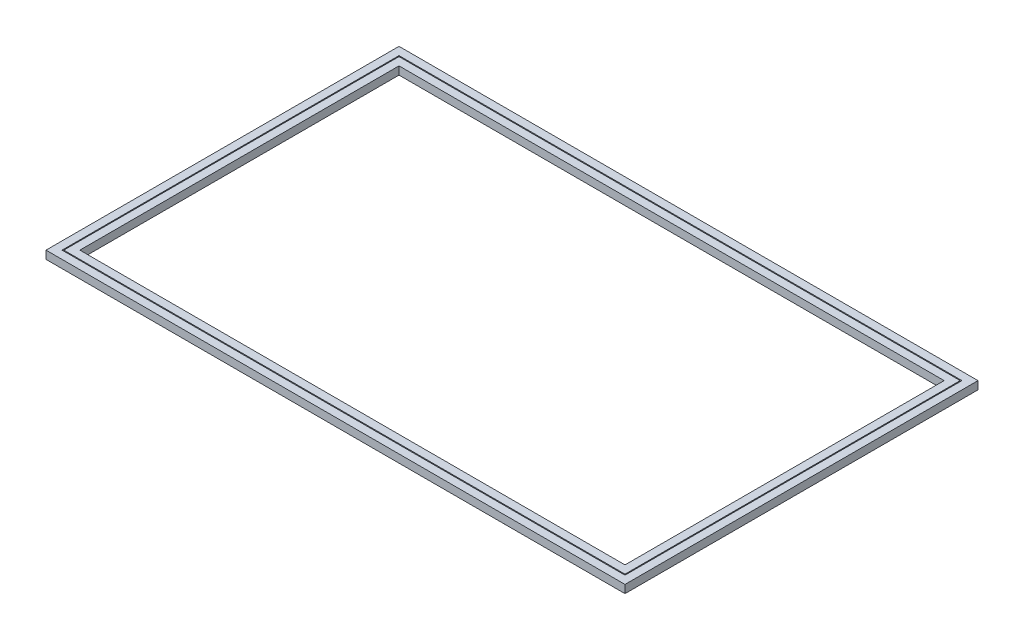
ISO-10303-21;
HEADER;
FILE_DESCRIPTION(('STEP AP214'),'2;1');
FILE_NAME('part.step','',(''),(''),'','','');
FILE_SCHEMA(('AUTOMOTIVE_DESIGN { 1 0 10303 214 1 1 1 1 }'));
ENDSEC;
DATA;
#1=APPLICATION_CONTEXT('core data for automotive mechanical design processes');
#2=APPLICATION_PROTOCOL_DEFINITION('international standard','automotive_design',2000,#1);
#3=PRODUCT_CONTEXT('',#1,'mechanical');
#4=PRODUCT('Part','Part','',(#3));
#5=PRODUCT_RELATED_PRODUCT_CATEGORY('part','',(#4));
#6=PRODUCT_DEFINITION_FORMATION('','',#4);
#7=PRODUCT_DEFINITION_CONTEXT('part definition',#1,'design');
#8=PRODUCT_DEFINITION('design','',#6,#7);
#9=PRODUCT_DEFINITION_SHAPE('','',#8);
#10=(LENGTH_UNIT() NAMED_UNIT(*) SI_UNIT(.MILLI.,.METRE.));
#11=(NAMED_UNIT(*) PLANE_ANGLE_UNIT() SI_UNIT($,.RADIAN.));
#12=(NAMED_UNIT(*) SI_UNIT($,.STERADIAN.) SOLID_ANGLE_UNIT());
#13=UNCERTAINTY_MEASURE_WITH_UNIT(LENGTH_MEASURE(1.E-05),#10,'distance_accuracy_value','');
#14=(GEOMETRIC_REPRESENTATION_CONTEXT(3) GLOBAL_UNCERTAINTY_ASSIGNED_CONTEXT((#13)) GLOBAL_UNIT_ASSIGNED_CONTEXT((#10,
#11,#12)) REPRESENTATION_CONTEXT('',''));
#15=CARTESIAN_POINT('',(0.,0.,0.));
#16=DIRECTION('',(0.,0.,1.));
#17=DIRECTION('',(1.,0.,0.));
#18=AXIS2_PLACEMENT_3D('',#15,#16,#17);
#19=CARTESIAN_POINT('',(0.,9.,189.11033394935));
#20=DIRECTION('',(0.,0.,1.));
#21=DIRECTION('',(1.,0.,0.));
#22=AXIS2_PLACEMENT_3D('',#19,#20,#21);
#23=PLANE('',#22);
#24=DIRECTION('',(-1.,0.,0.));
#25=VECTOR('',#24,1.);
#26=CARTESIAN_POINT('',(0.,0.,189.11033394935));
#27=LINE('',#26,#25);
#28=CARTESIAN_POINT('',(315.94131040575,0.,189.11033394935));
#29=VERTEX_POINT('',#28);
#30=CARTESIAN_POINT('',(-315.94131040575,0.,189.11033394935));
#31=VERTEX_POINT('',#30);
#32=EDGE_CURVE('E174',#29,#31,#27,.T.);
#33=ORIENTED_EDGE('',*,*,#32,.T.);
#34=DIRECTION('',(0.,-1.,0.));
#35=VECTOR('',#34,1.);
#36=CARTESIAN_POINT('',(-315.94131040575,9.,189.11033394935));
#37=LINE('',#36,#35);
#38=CARTESIAN_POINT('',(-315.94131040575,9.,189.11033394935));
#39=VERTEX_POINT('',#38);
#40=EDGE_CURVE('E13',#39,#31,#37,.T.);
#41=ORIENTED_EDGE('',*,*,#40,.F.);
#42=DIRECTION('',(-1.,0.,0.));
#43=VECTOR('',#42,1.);
#44=CARTESIAN_POINT('',(0.,9.,189.11033394935));
#45=LINE('',#44,#43);
#46=CARTESIAN_POINT('',(315.94131040575,9.,189.11033394935));
#47=VERTEX_POINT('',#46);
#48=EDGE_CURVE('E146',#47,#39,#45,.T.);
#49=ORIENTED_EDGE('',*,*,#48,.F.);
#50=DIRECTION('',(0.,-1.,0.));
#51=VECTOR('',#50,1.);
#52=CARTESIAN_POINT('',(315.94131040575,9.,189.11033394935));
#53=LINE('',#52,#51);
#54=EDGE_CURVE('E86',#47,#29,#53,.T.);
#55=ORIENTED_EDGE('',*,*,#54,.T.);
#56=EDGE_LOOP('',(#33,#41,#49,#55));
#57=FACE_BOUND('',#56,.T.);
#58=ADVANCED_FACE('F67',(#57),#23,.F.);
#59=CARTESIAN_POINT('',(-315.94131040575,9.,0.));
#60=DIRECTION('',(-1.,0.,0.));
#61=DIRECTION('',(0.,0.,1.));
#62=AXIS2_PLACEMENT_3D('',#59,#60,#61);
#63=PLANE('',#62);
#64=DIRECTION('',(0.,0.,-1.));
#65=VECTOR('',#64,1.);
#66=CARTESIAN_POINT('',(-315.94131040575,0.,0.));
#67=LINE('',#66,#65);
#68=CARTESIAN_POINT('',(-315.94131040575,0.,-189.11033394935));
#69=VERTEX_POINT('',#68);
#70=EDGE_CURVE('E152',#31,#69,#67,.T.);
#71=ORIENTED_EDGE('',*,*,#70,.T.);
#72=DIRECTION('',(0.,-1.,0.));
#73=VECTOR('',#72,1.);
#74=CARTESIAN_POINT('',(-315.94131040575,9.,-189.11033394935));
#75=LINE('',#74,#73);
#76=CARTESIAN_POINT('',(-315.94131040575,9.,-189.11033394935));
#77=VERTEX_POINT('',#76);
#78=EDGE_CURVE('E77',#77,#69,#75,.T.);
#79=ORIENTED_EDGE('',*,*,#78,.F.);
#80=DIRECTION('',(0.,0.,-1.));
#81=VECTOR('',#80,1.);
#82=CARTESIAN_POINT('',(-315.94131040575,9.,0.));
#83=LINE('',#82,#81);
#84=EDGE_CURVE('E140',#39,#77,#83,.T.);
#85=ORIENTED_EDGE('',*,*,#84,.F.);
#86=ORIENTED_EDGE('',*,*,#40,.T.);
#87=EDGE_LOOP('',(#71,#79,#85,#86));
#88=FACE_BOUND('',#87,.T.);
#89=ADVANCED_FACE('F151',(#88),#63,.F.);
#90=CARTESIAN_POINT('',(0.,9.,-189.11033394935));
#91=DIRECTION('',(0.,0.,1.));
#92=DIRECTION('',(1.,0.,0.));
#93=AXIS2_PLACEMENT_3D('',#90,#91,#92);
#94=PLANE('',#93);
#95=DIRECTION('',(-1.,0.,0.));
#96=VECTOR('',#95,1.);
#97=CARTESIAN_POINT('',(0.,0.,-189.11033394935));
#98=LINE('',#97,#96);
#99=CARTESIAN_POINT('',(315.94131040575,0.,-189.11033394935));
#100=VERTEX_POINT('',#99);
#101=EDGE_CURVE('E177',#100,#69,#98,.T.);
#102=ORIENTED_EDGE('',*,*,#101,.F.);
#103=DIRECTION('',(0.,-1.,0.));
#104=VECTOR('',#103,1.);
#105=CARTESIAN_POINT('',(315.94131040575,9.,-189.11033394935));
#106=LINE('',#105,#104);
#107=CARTESIAN_POINT('',(315.94131040575,9.,-189.11033394935));
#108=VERTEX_POINT('',#107);
#109=EDGE_CURVE('E112',#108,#100,#106,.T.);
#110=ORIENTED_EDGE('',*,*,#109,.F.);
#111=DIRECTION('',(-1.,0.,0.));
#112=VECTOR('',#111,1.);
#113=CARTESIAN_POINT('',(0.,9.,-189.11033394935));
#114=LINE('',#113,#112);
#115=EDGE_CURVE('E145',#108,#77,#114,.T.);
#116=ORIENTED_EDGE('',*,*,#115,.T.);
#117=ORIENTED_EDGE('',*,*,#78,.T.);
#118=EDGE_LOOP('',(#102,#110,#116,#117));
#119=FACE_BOUND('',#118,.T.);
#120=ADVANCED_FACE('F156',(#119),#94,.T.);
#121=CARTESIAN_POINT('',(-324.94131040575,9.,0.));
#122=DIRECTION('',(-1.,0.,0.));
#123=DIRECTION('',(0.,0.,1.));
#124=AXIS2_PLACEMENT_3D('',#121,#122,#123);
#125=PLANE('',#124);
#126=DIRECTION('',(0.,0.,-1.));
#127=VECTOR('',#126,1.);
#128=CARTESIAN_POINT('',(-324.94131040575,0.,0.));
#129=LINE('',#128,#127);
#130=CARTESIAN_POINT('',(-324.94131040575,0.,198.11033394935));
#131=VERTEX_POINT('',#130);
#132=CARTESIAN_POINT('',(-324.94131040575,0.,-198.11033394935));
#133=VERTEX_POINT('',#132);
#134=EDGE_CURVE('E163',#131,#133,#129,.T.);
#135=ORIENTED_EDGE('',*,*,#134,.F.);
#136=DIRECTION('',(0.,-1.,0.));
#137=VECTOR('',#136,1.);
#138=CARTESIAN_POINT('',(-324.94131040575,9.,198.11033394935));
#139=LINE('',#138,#137);
#140=CARTESIAN_POINT('',(-324.94131040575,9.,198.11033394935));
#141=VERTEX_POINT('',#140);
#142=EDGE_CURVE('E71',#141,#131,#139,.T.);
#143=ORIENTED_EDGE('',*,*,#142,.F.);
#144=DIRECTION('',(0.,0.,-1.));
#145=VECTOR('',#144,1.);
#146=CARTESIAN_POINT('',(-324.94131040575,9.,0.));
#147=LINE('',#146,#145);
#148=CARTESIAN_POINT('',(-324.94131040575,9.,-198.11033394935));
#149=VERTEX_POINT('',#148);
#150=EDGE_CURVE('E182',#141,#149,#147,.T.);
#151=ORIENTED_EDGE('',*,*,#150,.T.);
#152=DIRECTION('',(0.,-1.,0.));
#153=VECTOR('',#152,1.);
#154=CARTESIAN_POINT('',(-324.94131040575,9.,-198.11033394935));
#155=LINE('',#154,#153);
#156=EDGE_CURVE('E159',#149,#133,#155,.T.);
#157=ORIENTED_EDGE('',*,*,#156,.T.);
#158=EDGE_LOOP('',(#135,#143,#151,#157));
#159=FACE_BOUND('',#158,.T.);
#160=ADVANCED_FACE('F69',(#159),#125,.T.);
#161=CARTESIAN_POINT('',(0.,9.,198.11033394935));
#162=DIRECTION('',(0.,0.,1.));
#163=DIRECTION('',(1.,0.,0.));
#164=AXIS2_PLACEMENT_3D('',#161,#162,#163);
#165=PLANE('',#164);
#166=DIRECTION('',(-1.,0.,0.));
#167=VECTOR('',#166,1.);
#168=CARTESIAN_POINT('',(0.,0.,198.11033394935));
#169=LINE('',#168,#167);
#170=CARTESIAN_POINT('',(324.94131040575,0.,198.11033394935));
#171=VERTEX_POINT('',#170);
#172=EDGE_CURVE('E166',#171,#131,#169,.T.);
#173=ORIENTED_EDGE('',*,*,#172,.F.);
#174=DIRECTION('',(0.,-1.,0.));
#175=VECTOR('',#174,1.);
#176=CARTESIAN_POINT('',(324.94131040575,9.,198.11033394935));
#177=LINE('',#176,#175);
#178=CARTESIAN_POINT('',(324.94131040575,9.,198.11033394935));
#179=VERTEX_POINT('',#178);
#180=EDGE_CURVE('E188',#179,#171,#177,.T.);
#181=ORIENTED_EDGE('',*,*,#180,.F.);
#182=DIRECTION('',(-1.,0.,0.));
#183=VECTOR('',#182,1.);
#184=CARTESIAN_POINT('',(0.,9.,198.11033394935));
#185=LINE('',#184,#183);
#186=EDGE_CURVE('E197',#179,#141,#185,.T.);
#187=ORIENTED_EDGE('',*,*,#186,.T.);
#188=ORIENTED_EDGE('',*,*,#142,.T.);
#189=EDGE_LOOP('',(#173,#181,#187,#188));
#190=FACE_BOUND('',#189,.T.);
#191=ADVANCED_FACE('F195',(#190),#165,.T.);
#192=CARTESIAN_POINT('',(324.94131040575,9.,0.));
#193=DIRECTION('',(-1.,0.,0.));
#194=DIRECTION('',(0.,0.,1.));
#195=AXIS2_PLACEMENT_3D('',#192,#193,#194);
#196=PLANE('',#195);
#197=DIRECTION('',(0.,0.,-1.));
#198=VECTOR('',#197,1.);
#199=CARTESIAN_POINT('',(324.94131040575,0.,0.));
#200=LINE('',#199,#198);
#201=CARTESIAN_POINT('',(324.94131040575,0.,-198.11033394935));
#202=VERTEX_POINT('',#201);
#203=EDGE_CURVE('E169',#171,#202,#200,.T.);
#204=ORIENTED_EDGE('',*,*,#203,.T.);
#205=DIRECTION('',(0.,-1.,0.));
#206=VECTOR('',#205,1.);
#207=CARTESIAN_POINT('',(324.94131040575,9.,-198.11033394935));
#208=LINE('',#207,#206);
#209=CARTESIAN_POINT('',(324.94131040575,9.,-198.11033394935));
#210=VERTEX_POINT('',#209);
#211=EDGE_CURVE('E186',#210,#202,#208,.T.);
#212=ORIENTED_EDGE('',*,*,#211,.F.);
#213=DIRECTION('',(0.,0.,-1.));
#214=VECTOR('',#213,1.);
#215=CARTESIAN_POINT('',(324.94131040575,9.,0.));
#216=LINE('',#215,#214);
#217=EDGE_CURVE('E210',#179,#210,#216,.T.);
#218=ORIENTED_EDGE('',*,*,#217,.F.);
#219=ORIENTED_EDGE('',*,*,#180,.T.);
#220=EDGE_LOOP('',(#204,#212,#218,#219));
#221=FACE_BOUND('',#220,.T.);
#222=ADVANCED_FACE('F204',(#221),#196,.F.);
#223=CARTESIAN_POINT('',(0.,9.,-198.11033394935));
#224=DIRECTION('',(0.,0.,1.));
#225=DIRECTION('',(1.,0.,0.));
#226=AXIS2_PLACEMENT_3D('',#223,#224,#225);
#227=PLANE('',#226);
#228=DIRECTION('',(-1.,0.,0.));
#229=VECTOR('',#228,1.);
#230=CARTESIAN_POINT('',(0.,0.,-198.11033394935));
#231=LINE('',#230,#229);
#232=EDGE_CURVE('E171',#202,#133,#231,.T.);
#233=ORIENTED_EDGE('',*,*,#232,.T.);
#234=ORIENTED_EDGE('',*,*,#156,.F.);
#235=DIRECTION('',(-1.,0.,0.));
#236=VECTOR('',#235,1.);
#237=CARTESIAN_POINT('',(0.,9.,-198.11033394935));
#238=LINE('',#237,#236);
#239=EDGE_CURVE('E208',#210,#149,#238,.T.);
#240=ORIENTED_EDGE('',*,*,#239,.F.);
#241=ORIENTED_EDGE('',*,*,#211,.T.);
#242=EDGE_LOOP('',(#233,#234,#240,#241));
#243=FACE_BOUND('',#242,.T.);
#244=ADVANCED_FACE('F207',(#243),#227,.F.);
#245=CARTESIAN_POINT('',(315.94131040575,9.,0.));
#246=DIRECTION('',(-1.,0.,0.));
#247=DIRECTION('',(0.,0.,1.));
#248=AXIS2_PLACEMENT_3D('',#245,#246,#247);
#249=PLANE('',#248);
#250=DIRECTION('',(0.,0.,-1.));
#251=VECTOR('',#250,1.);
#252=CARTESIAN_POINT('',(315.94131040575,0.,0.));
#253=LINE('',#252,#251);
#254=EDGE_CURVE('E179',#29,#100,#253,.T.);
#255=ORIENTED_EDGE('',*,*,#254,.F.);
#256=ORIENTED_EDGE('',*,*,#54,.F.);
#257=DIRECTION('',(0.,0.,-1.));
#258=VECTOR('',#257,1.);
#259=CARTESIAN_POINT('',(315.94131040575,9.,0.));
#260=LINE('',#259,#258);
#261=EDGE_CURVE('E157',#47,#108,#260,.T.);
#262=ORIENTED_EDGE('',*,*,#261,.T.);
#263=ORIENTED_EDGE('',*,*,#109,.T.);
#264=EDGE_LOOP('',(#255,#256,#262,#263));
#265=FACE_BOUND('',#264,.T.);
#266=ADVANCED_FACE('F216',(#265),#249,.T.);
#267=CARTESIAN_POINT('',(0.,9.,0.));
#268=DIRECTION('',(0.,1.,0.));
#269=DIRECTION('',(0.,0.,1.));
#270=AXIS2_PLACEMENT_3D('',#267,#268,#269);
#271=PLANE('',#270);
#272=ORIENTED_EDGE('',*,*,#150,.F.);
#273=ORIENTED_EDGE('',*,*,#186,.F.);
#274=ORIENTED_EDGE('',*,*,#217,.T.);
#275=ORIENTED_EDGE('',*,*,#239,.T.);
#276=EDGE_LOOP('',(#272,#273,#274,#275));
#277=FACE_BOUND('',#276,.T.);
#278=ORIENTED_EDGE('',*,*,#48,.T.);
#279=ORIENTED_EDGE('',*,*,#84,.T.);
#280=ORIENTED_EDGE('',*,*,#115,.F.);
#281=ORIENTED_EDGE('',*,*,#261,.F.);
#282=EDGE_LOOP('',(#278,#279,#280,#281));
#283=FACE_BOUND('',#282,.T.);
#284=ADVANCED_FACE('F142',(#277,#283),#271,.T.);
#285=CARTESIAN_POINT('',(0.,0.,0.));
#286=DIRECTION('',(0.,1.,0.));
#287=DIRECTION('',(0.,0.,1.));
#288=AXIS2_PLACEMENT_3D('',#285,#286,#287);
#289=PLANE('',#288);
#290=ORIENTED_EDGE('',*,*,#134,.T.);
#291=ORIENTED_EDGE('',*,*,#232,.F.);
#292=ORIENTED_EDGE('',*,*,#203,.F.);
#293=ORIENTED_EDGE('',*,*,#172,.T.);
#294=EDGE_LOOP('',(#290,#291,#292,#293));
#295=FACE_BOUND('',#294,.T.);
#296=ORIENTED_EDGE('',*,*,#32,.F.);
#297=ORIENTED_EDGE('',*,*,#254,.T.);
#298=ORIENTED_EDGE('',*,*,#101,.T.);
#299=ORIENTED_EDGE('',*,*,#70,.F.);
#300=EDGE_LOOP('',(#296,#297,#298,#299));
#301=FACE_BOUND('',#300,.T.);
#302=ADVANCED_FACE('F201',(#295,#301),#289,.F.);
#303=CLOSED_SHELL('',(#58,#89,#120,#160,#191,#222,#244,#266,#284,#302));
#304=MANIFOLD_SOLID_BREP('B2',#303);
#305=CARTESIAN_POINT('',(0.,9.,179.11033394935));
#306=DIRECTION('',(0.,0.,1.));
#307=DIRECTION('',(1.,0.,0.));
#308=AXIS2_PLACEMENT_3D('',#305,#306,#307);
#309=PLANE('',#308);
#310=DIRECTION('',(-1.,0.,0.));
#311=VECTOR('',#310,1.);
#312=CARTESIAN_POINT('',(0.,0.,179.11033394935));
#313=LINE('',#312,#311);
#314=CARTESIAN_POINT('',(305.94131040575,0.,179.11033394935));
#315=VERTEX_POINT('',#314);
#316=CARTESIAN_POINT('',(-305.94131040575,0.,179.11033394935));
#317=VERTEX_POINT('',#316);
#318=EDGE_CURVE('E404',#315,#317,#313,.T.);
#319=ORIENTED_EDGE('',*,*,#318,.T.);
#320=DIRECTION('',(0.,-1.,0.));
#321=VECTOR('',#320,1.);
#322=CARTESIAN_POINT('',(-305.94131040575,9.,179.11033394935));
#323=LINE('',#322,#321);
#324=CARTESIAN_POINT('',(-305.94131040575,9.,179.11033394935));
#325=VERTEX_POINT('',#324);
#326=EDGE_CURVE('E65',#325,#317,#323,.T.);
#327=ORIENTED_EDGE('',*,*,#326,.F.);
#328=DIRECTION('',(-1.,0.,0.));
#329=VECTOR('',#328,1.);
#330=CARTESIAN_POINT('',(0.,9.,179.11033394935));
#331=LINE('',#330,#329);
#332=CARTESIAN_POINT('',(305.94131040575,9.,179.11033394935));
#333=VERTEX_POINT('',#332);
#334=EDGE_CURVE('E376',#333,#325,#331,.T.);
#335=ORIENTED_EDGE('',*,*,#334,.F.);
#336=DIRECTION('',(0.,-1.,0.));
#337=VECTOR('',#336,1.);
#338=CARTESIAN_POINT('',(305.94131040575,9.,179.11033394935));
#339=LINE('',#338,#337);
#340=EDGE_CURVE('E316',#333,#315,#339,.T.);
#341=ORIENTED_EDGE('',*,*,#340,.T.);
#342=EDGE_LOOP('',(#319,#327,#335,#341));
#343=FACE_BOUND('',#342,.T.);
#344=ADVANCED_FACE('F297',(#343),#309,.F.);
#345=CARTESIAN_POINT('',(-305.94131040575,9.,0.));
#346=DIRECTION('',(-1.,0.,0.));
#347=DIRECTION('',(0.,0.,1.));
#348=AXIS2_PLACEMENT_3D('',#345,#346,#347);
#349=PLANE('',#348);
#350=DIRECTION('',(0.,0.,-1.));
#351=VECTOR('',#350,1.);
#352=CARTESIAN_POINT('',(-305.94131040575,0.,0.));
#353=LINE('',#352,#351);
#354=CARTESIAN_POINT('',(-305.94131040575,0.,-179.11033394935));
#355=VERTEX_POINT('',#354);
#356=EDGE_CURVE('E382',#317,#355,#353,.T.);
#357=ORIENTED_EDGE('',*,*,#356,.T.);
#358=DIRECTION('',(0.,-1.,0.));
#359=VECTOR('',#358,1.);
#360=CARTESIAN_POINT('',(-305.94131040575,9.,-179.11033394935));
#361=LINE('',#360,#359);
#362=CARTESIAN_POINT('',(-305.94131040575,9.,-179.11033394935));
#363=VERTEX_POINT('',#362);
#364=EDGE_CURVE('E307',#363,#355,#361,.T.);
#365=ORIENTED_EDGE('',*,*,#364,.F.);
#366=DIRECTION('',(0.,0.,-1.));
#367=VECTOR('',#366,1.);
#368=CARTESIAN_POINT('',(-305.94131040575,9.,0.));
#369=LINE('',#368,#367);
#370=EDGE_CURVE('E370',#325,#363,#369,.T.);
#371=ORIENTED_EDGE('',*,*,#370,.F.);
#372=ORIENTED_EDGE('',*,*,#326,.T.);
#373=EDGE_LOOP('',(#357,#365,#371,#372));
#374=FACE_BOUND('',#373,.T.);
#375=ADVANCED_FACE('F381',(#374),#349,.F.);
#376=CARTESIAN_POINT('',(0.,9.,-179.11033394935));
#377=DIRECTION('',(0.,0.,1.));
#378=DIRECTION('',(1.,0.,0.));
#379=AXIS2_PLACEMENT_3D('',#376,#377,#378);
#380=PLANE('',#379);
#381=DIRECTION('',(-1.,0.,0.));
#382=VECTOR('',#381,1.);
#383=CARTESIAN_POINT('',(0.,0.,-179.11033394935));
#384=LINE('',#383,#382);
#385=CARTESIAN_POINT('',(305.94131040575,0.,-179.11033394935));
#386=VERTEX_POINT('',#385);
#387=EDGE_CURVE('E407',#386,#355,#384,.T.);
#388=ORIENTED_EDGE('',*,*,#387,.F.);
#389=DIRECTION('',(0.,-1.,0.));
#390=VECTOR('',#389,1.);
#391=CARTESIAN_POINT('',(305.94131040575,9.,-179.11033394935));
#392=LINE('',#391,#390);
#393=CARTESIAN_POINT('',(305.94131040575,9.,-179.11033394935));
#394=VERTEX_POINT('',#393);
#395=EDGE_CURVE('E342',#394,#386,#392,.T.);
#396=ORIENTED_EDGE('',*,*,#395,.F.);
#397=DIRECTION('',(-1.,0.,0.));
#398=VECTOR('',#397,1.);
#399=CARTESIAN_POINT('',(0.,9.,-179.11033394935));
#400=LINE('',#399,#398);
#401=EDGE_CURVE('E375',#394,#363,#400,.T.);
#402=ORIENTED_EDGE('',*,*,#401,.T.);
#403=ORIENTED_EDGE('',*,*,#364,.T.);
#404=EDGE_LOOP('',(#388,#396,#402,#403));
#405=FACE_BOUND('',#404,.T.);
#406=ADVANCED_FACE('F386',(#405),#380,.T.);
#407=CARTESIAN_POINT('',(-314.94131040575,9.,0.));
#408=DIRECTION('',(-1.,0.,0.));
#409=DIRECTION('',(0.,0.,1.));
#410=AXIS2_PLACEMENT_3D('',#407,#408,#409);
#411=PLANE('',#410);
#412=DIRECTION('',(0.,0.,-1.));
#413=VECTOR('',#412,1.);
#414=CARTESIAN_POINT('',(-314.94131040575,0.,0.));
#415=LINE('',#414,#413);
#416=CARTESIAN_POINT('',(-314.94131040575,0.,188.11033394935));
#417=VERTEX_POINT('',#416);
#418=CARTESIAN_POINT('',(-314.94131040575,0.,-188.11033394935));
#419=VERTEX_POINT('',#418);
#420=EDGE_CURVE('E393',#417,#419,#415,.T.);
#421=ORIENTED_EDGE('',*,*,#420,.F.);
#422=DIRECTION('',(0.,-1.,0.));
#423=VECTOR('',#422,1.);
#424=CARTESIAN_POINT('',(-314.94131040575,9.,188.11033394935));
#425=LINE('',#424,#423);
#426=CARTESIAN_POINT('',(-314.94131040575,9.,188.11033394935));
#427=VERTEX_POINT('',#426);
#428=EDGE_CURVE('E301',#427,#417,#425,.T.);
#429=ORIENTED_EDGE('',*,*,#428,.F.);
#430=DIRECTION('',(0.,0.,-1.));
#431=VECTOR('',#430,1.);
#432=CARTESIAN_POINT('',(-314.94131040575,9.,0.));
#433=LINE('',#432,#431);
#434=CARTESIAN_POINT('',(-314.94131040575,9.,-188.11033394935));
#435=VERTEX_POINT('',#434);
#436=EDGE_CURVE('E412',#427,#435,#433,.T.);
#437=ORIENTED_EDGE('',*,*,#436,.T.);
#438=DIRECTION('',(0.,-1.,0.));
#439=VECTOR('',#438,1.);
#440=CARTESIAN_POINT('',(-314.94131040575,9.,-188.11033394935));
#441=LINE('',#440,#439);
#442=EDGE_CURVE('E389',#435,#419,#441,.T.);
#443=ORIENTED_EDGE('',*,*,#442,.T.);
#444=EDGE_LOOP('',(#421,#429,#437,#443));
#445=FACE_BOUND('',#444,.T.);
#446=ADVANCED_FACE('F299',(#445),#411,.T.);
#447=CARTESIAN_POINT('',(0.,9.,188.11033394935));
#448=DIRECTION('',(0.,0.,1.));
#449=DIRECTION('',(1.,0.,0.));
#450=AXIS2_PLACEMENT_3D('',#447,#448,#449);
#451=PLANE('',#450);
#452=DIRECTION('',(-1.,0.,0.));
#453=VECTOR('',#452,1.);
#454=CARTESIAN_POINT('',(0.,0.,188.11033394935));
#455=LINE('',#454,#453);
#456=CARTESIAN_POINT('',(314.94131040575,0.,188.11033394935));
#457=VERTEX_POINT('',#456);
#458=EDGE_CURVE('E396',#457,#417,#455,.T.);
#459=ORIENTED_EDGE('',*,*,#458,.F.);
#460=DIRECTION('',(0.,-1.,0.));
#461=VECTOR('',#460,1.);
#462=CARTESIAN_POINT('',(314.94131040575,9.,188.11033394935));
#463=LINE('',#462,#461);
#464=CARTESIAN_POINT('',(314.94131040575,9.,188.11033394935));
#465=VERTEX_POINT('',#464);
#466=EDGE_CURVE('E418',#465,#457,#463,.T.);
#467=ORIENTED_EDGE('',*,*,#466,.F.);
#468=DIRECTION('',(-1.,0.,0.));
#469=VECTOR('',#468,1.);
#470=CARTESIAN_POINT('',(0.,9.,188.11033394935));
#471=LINE('',#470,#469);
#472=EDGE_CURVE('E427',#465,#427,#471,.T.);
#473=ORIENTED_EDGE('',*,*,#472,.T.);
#474=ORIENTED_EDGE('',*,*,#428,.T.);
#475=EDGE_LOOP('',(#459,#467,#473,#474));
#476=FACE_BOUND('',#475,.T.);
#477=ADVANCED_FACE('F425',(#476),#451,.T.);
#478=CARTESIAN_POINT('',(314.94131040575,9.,0.));
#479=DIRECTION('',(-1.,0.,0.));
#480=DIRECTION('',(0.,0.,1.));
#481=AXIS2_PLACEMENT_3D('',#478,#479,#480);
#482=PLANE('',#481);
#483=DIRECTION('',(0.,0.,-1.));
#484=VECTOR('',#483,1.);
#485=CARTESIAN_POINT('',(314.94131040575,0.,0.));
#486=LINE('',#485,#484);
#487=CARTESIAN_POINT('',(314.94131040575,0.,-188.11033394935));
#488=VERTEX_POINT('',#487);
#489=EDGE_CURVE('E399',#457,#488,#486,.T.);
#490=ORIENTED_EDGE('',*,*,#489,.T.);
#491=DIRECTION('',(0.,-1.,0.));
#492=VECTOR('',#491,1.);
#493=CARTESIAN_POINT('',(314.94131040575,9.,-188.11033394935));
#494=LINE('',#493,#492);
#495=CARTESIAN_POINT('',(314.94131040575,9.,-188.11033394935));
#496=VERTEX_POINT('',#495);
#497=EDGE_CURVE('E416',#496,#488,#494,.T.);
#498=ORIENTED_EDGE('',*,*,#497,.F.);
#499=DIRECTION('',(0.,0.,-1.));
#500=VECTOR('',#499,1.);
#501=CARTESIAN_POINT('',(314.94131040575,9.,0.));
#502=LINE('',#501,#500);
#503=EDGE_CURVE('E440',#465,#496,#502,.T.);
#504=ORIENTED_EDGE('',*,*,#503,.F.);
#505=ORIENTED_EDGE('',*,*,#466,.T.);
#506=EDGE_LOOP('',(#490,#498,#504,#505));
#507=FACE_BOUND('',#506,.T.);
#508=ADVANCED_FACE('F434',(#507),#482,.F.);
#509=CARTESIAN_POINT('',(0.,9.,-188.11033394935));
#510=DIRECTION('',(0.,0.,1.));
#511=DIRECTION('',(1.,0.,0.));
#512=AXIS2_PLACEMENT_3D('',#509,#510,#511);
#513=PLANE('',#512);
#514=DIRECTION('',(-1.,0.,0.));
#515=VECTOR('',#514,1.);
#516=CARTESIAN_POINT('',(0.,0.,-188.11033394935));
#517=LINE('',#516,#515);
#518=EDGE_CURVE('E401',#488,#419,#517,.T.);
#519=ORIENTED_EDGE('',*,*,#518,.T.);
#520=ORIENTED_EDGE('',*,*,#442,.F.);
#521=DIRECTION('',(-1.,0.,0.));
#522=VECTOR('',#521,1.);
#523=CARTESIAN_POINT('',(0.,9.,-188.11033394935));
#524=LINE('',#523,#522);
#525=EDGE_CURVE('E438',#496,#435,#524,.T.);
#526=ORIENTED_EDGE('',*,*,#525,.F.);
#527=ORIENTED_EDGE('',*,*,#497,.T.);
#528=EDGE_LOOP('',(#519,#520,#526,#527));
#529=FACE_BOUND('',#528,.T.);
#530=ADVANCED_FACE('F437',(#529),#513,.F.);
#531=CARTESIAN_POINT('',(305.94131040575,9.,0.));
#532=DIRECTION('',(-1.,0.,0.));
#533=DIRECTION('',(0.,0.,1.));
#534=AXIS2_PLACEMENT_3D('',#531,#532,#533);
#535=PLANE('',#534);
#536=DIRECTION('',(0.,0.,-1.));
#537=VECTOR('',#536,1.);
#538=CARTESIAN_POINT('',(305.94131040575,0.,0.));
#539=LINE('',#538,#537);
#540=EDGE_CURVE('E409',#315,#386,#539,.T.);
#541=ORIENTED_EDGE('',*,*,#540,.F.);
#542=ORIENTED_EDGE('',*,*,#340,.F.);
#543=DIRECTION('',(0.,0.,-1.));
#544=VECTOR('',#543,1.);
#545=CARTESIAN_POINT('',(305.94131040575,9.,0.));
#546=LINE('',#545,#544);
#547=EDGE_CURVE('E387',#333,#394,#546,.T.);
#548=ORIENTED_EDGE('',*,*,#547,.T.);
#549=ORIENTED_EDGE('',*,*,#395,.T.);
#550=EDGE_LOOP('',(#541,#542,#548,#549));
#551=FACE_BOUND('',#550,.T.);
#552=ADVANCED_FACE('F446',(#551),#535,.T.);
#553=CARTESIAN_POINT('',(0.,9.,0.));
#554=DIRECTION('',(0.,1.,0.));
#555=DIRECTION('',(0.,0.,1.));
#556=AXIS2_PLACEMENT_3D('',#553,#554,#555);
#557=PLANE('',#556);
#558=ORIENTED_EDGE('',*,*,#436,.F.);
#559=ORIENTED_EDGE('',*,*,#472,.F.);
#560=ORIENTED_EDGE('',*,*,#503,.T.);
#561=ORIENTED_EDGE('',*,*,#525,.T.);
#562=EDGE_LOOP('',(#558,#559,#560,#561));
#563=FACE_BOUND('',#562,.T.);
#564=ORIENTED_EDGE('',*,*,#334,.T.);
#565=ORIENTED_EDGE('',*,*,#370,.T.);
#566=ORIENTED_EDGE('',*,*,#401,.F.);
#567=ORIENTED_EDGE('',*,*,#547,.F.);
#568=EDGE_LOOP('',(#564,#565,#566,#567));
#569=FACE_BOUND('',#568,.T.);
#570=ADVANCED_FACE('F372',(#563,#569),#557,.T.);
#571=CARTESIAN_POINT('',(0.,0.,0.));
#572=DIRECTION('',(0.,1.,0.));
#573=DIRECTION('',(0.,0.,1.));
#574=AXIS2_PLACEMENT_3D('',#571,#572,#573);
#575=PLANE('',#574);
#576=ORIENTED_EDGE('',*,*,#420,.T.);
#577=ORIENTED_EDGE('',*,*,#518,.F.);
#578=ORIENTED_EDGE('',*,*,#489,.F.);
#579=ORIENTED_EDGE('',*,*,#458,.T.);
#580=EDGE_LOOP('',(#576,#577,#578,#579));
#581=FACE_BOUND('',#580,.T.);
#582=ORIENTED_EDGE('',*,*,#318,.F.);
#583=ORIENTED_EDGE('',*,*,#540,.T.);
#584=ORIENTED_EDGE('',*,*,#387,.T.);
#585=ORIENTED_EDGE('',*,*,#356,.F.);
#586=EDGE_LOOP('',(#582,#583,#584,#585));
#587=FACE_BOUND('',#586,.T.);
#588=ADVANCED_FACE('F431',(#581,#587),#575,.F.);
#589=CLOSED_SHELL('',(#344,#375,#406,#446,#477,#508,#530,#552,#570,#588));
#590=MANIFOLD_SOLID_BREP('B7',#589);
#591=ADVANCED_BREP_SHAPE_REPRESENTATION('',(#18,#304,#590),#14);
#592=SHAPE_DEFINITION_REPRESENTATION(#9,#591);
ENDSEC;
END-ISO-10303-21;
